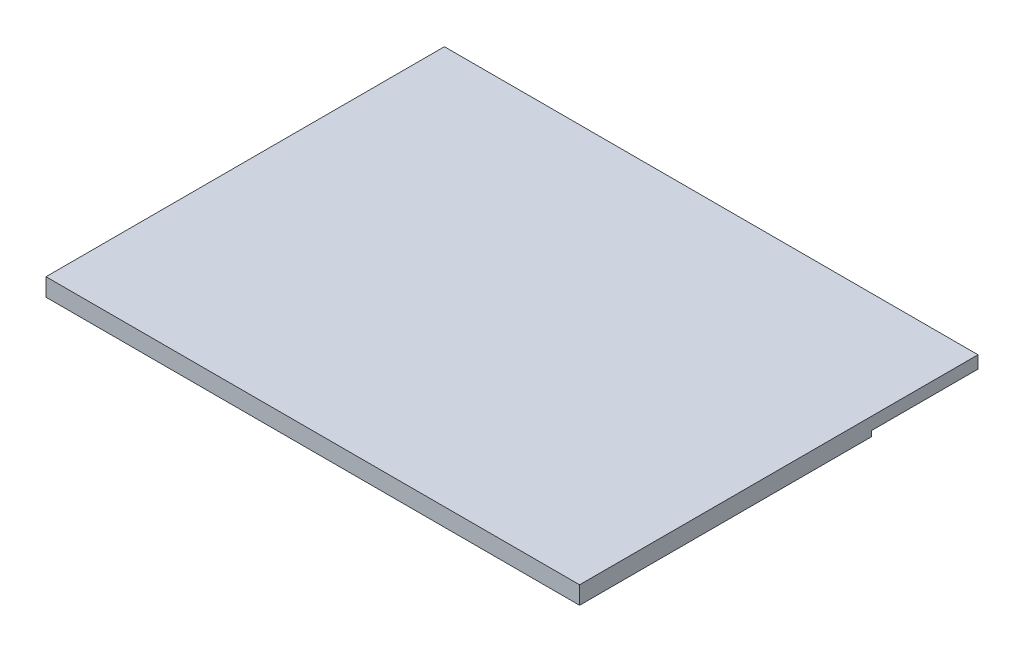
ISO-10303-21;
HEADER;
FILE_DESCRIPTION(('STEP AP214'),'2;1');
FILE_NAME('part.step','',(''),(''),'','','');
FILE_SCHEMA(('AUTOMOTIVE_DESIGN { 1 0 10303 214 1 1 1 1 }'));
ENDSEC;
DATA;
#1=APPLICATION_CONTEXT('core data for automotive mechanical design processes');
#2=APPLICATION_PROTOCOL_DEFINITION('international standard','automotive_design',2000,#1);
#3=PRODUCT_CONTEXT('',#1,'mechanical');
#4=PRODUCT('Part','Part','',(#3));
#5=PRODUCT_RELATED_PRODUCT_CATEGORY('part','',(#4));
#6=PRODUCT_DEFINITION_FORMATION('','',#4);
#7=PRODUCT_DEFINITION_CONTEXT('part definition',#1,'design');
#8=PRODUCT_DEFINITION('design','',#6,#7);
#9=PRODUCT_DEFINITION_SHAPE('','',#8);
#10=(LENGTH_UNIT() NAMED_UNIT(*) SI_UNIT(.MILLI.,.METRE.));
#11=(NAMED_UNIT(*) PLANE_ANGLE_UNIT() SI_UNIT($,.RADIAN.));
#12=(NAMED_UNIT(*) SI_UNIT($,.STERADIAN.) SOLID_ANGLE_UNIT());
#13=UNCERTAINTY_MEASURE_WITH_UNIT(LENGTH_MEASURE(1.E-05),#10,'distance_accuracy_value','');
#14=(GEOMETRIC_REPRESENTATION_CONTEXT(3) GLOBAL_UNCERTAINTY_ASSIGNED_CONTEXT((#13)) GLOBAL_UNIT_ASSIGNED_CONTEXT((#10,
#11,#12)) REPRESENTATION_CONTEXT('',''));
#15=CARTESIAN_POINT('',(0.,0.,0.));
#16=DIRECTION('',(0.,0.,1.));
#17=DIRECTION('',(1.,0.,0.));
#18=AXIS2_PLACEMENT_3D('',#15,#16,#17);
#19=CARTESIAN_POINT('',(141.251471862576,-4.6,188.57986601637));
#20=DIRECTION('',(0.,-1.,0.));
#21=DIRECTION('',(0.,0.,-1.));
#22=AXIS2_PLACEMENT_3D('',#19,#20,#21);
#23=PLANE('',#22);
#24=DIRECTION('',(1.,0.,0.));
#25=VECTOR('',#24,1.);
#26=CARTESIAN_POINT('',(141.251471862576,-4.6,51.));
#27=LINE('',#26,#25);
#28=CARTESIAN_POINT('',(5.74852813742385,-4.6,51.));
#29=VERTEX_POINT('',#28);
#30=CARTESIAN_POINT('',(139.251471862576,-4.6,51.));
#31=VERTEX_POINT('',#30);
#32=EDGE_CURVE('E219',#29,#31,#27,.T.);
#33=ORIENTED_EDGE('',*,*,#32,.F.);
#34=DIRECTION('',(0.,0.,-1.));
#35=VECTOR('',#34,1.);
#36=CARTESIAN_POINT('',(5.74852813742385,-4.6,188.57986601637));
#37=LINE('',#36,#35);
#38=CARTESIAN_POINT('',(5.74852813742385,-4.6,-56.));
#39=VERTEX_POINT('',#38);
#40=EDGE_CURVE('E277',#29,#39,#37,.T.);
#41=ORIENTED_EDGE('',*,*,#40,.T.);
#42=DIRECTION('',(-1.,0.,0.));
#43=VECTOR('',#42,1.);
#44=CARTESIAN_POINT('',(141.251471862576,-4.6,-56.));
#45=LINE('',#44,#43);
#46=CARTESIAN_POINT('',(139.251471862576,-4.6,-56.));
#47=VERTEX_POINT('',#46);
#48=EDGE_CURVE('E228',#47,#39,#45,.T.);
#49=ORIENTED_EDGE('',*,*,#48,.F.);
#50=DIRECTION('',(0.,0.,1.));
#51=VECTOR('',#50,1.);
#52=CARTESIAN_POINT('',(139.251471862576,-4.6,188.57986601637));
#53=LINE('',#52,#51);
#54=EDGE_CURVE('E275',#47,#31,#53,.T.);
#55=ORIENTED_EDGE('',*,*,#54,.T.);
#56=EDGE_LOOP('',(#33,#41,#49,#55));
#57=FACE_BOUND('',#56,.T.);
#58=DIRECTION('',(1.,0.,0.));
#59=VECTOR('',#58,1.);
#60=CARTESIAN_POINT('',(6.8485281374239,-4.6,-50.8));
#61=LINE('',#60,#59);
#62=CARTESIAN_POINT('',(6.8485281374239,-4.6,-50.8));
#63=VERTEX_POINT('',#62);
#64=CARTESIAN_POINT('',(138.151471862576,-4.6,-50.8));
#65=VERTEX_POINT('',#64);
#66=EDGE_CURVE('E181',#63,#65,#61,.T.);
#67=ORIENTED_EDGE('',*,*,#66,.F.);
#68=DIRECTION('',(0.,0.,-1.));
#69=VECTOR('',#68,1.);
#70=CARTESIAN_POINT('',(6.8485281374239,-4.6,-50.8));
#71=LINE('',#70,#69);
#72=CARTESIAN_POINT('',(6.8485281374239,-4.6,-35.8));
#73=VERTEX_POINT('',#72);
#74=EDGE_CURVE('E175',#73,#63,#71,.T.);
#75=ORIENTED_EDGE('',*,*,#74,.F.);
#76=DIRECTION('',(-1.,0.,0.));
#77=VECTOR('',#76,1.);
#78=CARTESIAN_POINT('',(6.8485281374239,-4.6,-35.8));
#79=LINE('',#78,#77);
#80=CARTESIAN_POINT('',(138.151471862576,-4.6,-35.8));
#81=VERTEX_POINT('',#80);
#82=EDGE_CURVE('E160',#81,#73,#79,.T.);
#83=ORIENTED_EDGE('',*,*,#82,.F.);
#84=DIRECTION('',(0.,0.,1.));
#85=VECTOR('',#84,1.);
#86=CARTESIAN_POINT('',(138.151471862576,-4.6,-50.8));
#87=LINE('',#86,#85);
#88=EDGE_CURVE('E169',#65,#81,#87,.T.);
#89=ORIENTED_EDGE('',*,*,#88,.F.);
#90=EDGE_LOOP('',(#67,#75,#83,#89));
#91=FACE_BOUND('',#90,.T.);
#92=ADVANCED_FACE('F41',(#57,#91),#23,.T.);
#93=CARTESIAN_POINT('',(-2.49999999999999,5.,-56.));
#94=DIRECTION('',(0.,0.,1.));
#95=DIRECTION('',(1.,0.,0.));
#96=AXIS2_PLACEMENT_3D('',#93,#94,#95);
#97=PLANE('',#96);
#98=DIRECTION('',(0.,-1.,0.));
#99=VECTOR('',#98,1.);
#100=CARTESIAN_POINT('',(147.5,5.,-56.));
#101=LINE('',#100,#99);
#102=CARTESIAN_POINT('',(147.5,5.,-56.));
#103=VERTEX_POINT('',#102);
#104=CARTESIAN_POINT('',(147.5,1.5,-56.));
#105=VERTEX_POINT('',#104);
#106=EDGE_CURVE('E249',#103,#105,#101,.T.);
#107=ORIENTED_EDGE('',*,*,#106,.T.);
#108=DIRECTION('',(1.,0.,0.));
#109=VECTOR('',#108,1.);
#110=CARTESIAN_POINT('',(147.5,1.5,-56.));
#111=LINE('',#110,#109);
#112=CARTESIAN_POINT('',(-2.5,1.50000000000009,-56.));
#113=VERTEX_POINT('',#112);
#114=EDGE_CURVE('E194',#113,#105,#111,.T.);
#115=ORIENTED_EDGE('',*,*,#114,.F.);
#116=DIRECTION('',(0.,-1.,0.));
#117=VECTOR('',#116,1.);
#118=CARTESIAN_POINT('',(-2.49999999999999,5.,-56.));
#119=LINE('',#118,#117);
#120=CARTESIAN_POINT('',(-2.49999999999999,5.,-56.));
#121=VERTEX_POINT('',#120);
#122=EDGE_CURVE('E267',#121,#113,#119,.T.);
#123=ORIENTED_EDGE('',*,*,#122,.F.);
#124=DIRECTION('',(-1.,0.,0.));
#125=VECTOR('',#124,1.);
#126=CARTESIAN_POINT('',(-2.49999999999999,5.,-56.));
#127=LINE('',#126,#125);
#128=EDGE_CURVE('E254',#103,#121,#127,.T.);
#129=ORIENTED_EDGE('',*,*,#128,.F.);
#130=EDGE_LOOP('',(#107,#115,#123,#129));
#131=FACE_BOUND('',#130,.T.);
#132=ADVANCED_FACE('F330',(#131),#97,.F.);
#133=CARTESIAN_POINT('',(0.,0.,0.));
#134=DIRECTION('',(0.,1.,0.));
#135=DIRECTION('',(0.,0.,1.));
#136=AXIS2_PLACEMENT_3D('',#133,#134,#135);
#137=PLANE('',#136);
#138=DIRECTION('',(-1.,0.,0.));
#139=VECTOR('',#138,1.);
#140=CARTESIAN_POINT('',(0.,0.,-26.));
#141=LINE('',#140,#139);
#142=CARTESIAN_POINT('',(147.5,0.,-26.));
#143=VERTEX_POINT('',#142);
#144=CARTESIAN_POINT('',(136.651471862576,0.,-26.));
#145=VERTEX_POINT('',#144);
#146=EDGE_CURVE('E209',#143,#145,#141,.T.);
#147=ORIENTED_EDGE('',*,*,#146,.F.);
#148=DIRECTION('',(0.,0.,1.));
#149=VECTOR('',#148,1.);
#150=CARTESIAN_POINT('',(147.5,0.,-56.));
#151=LINE('',#150,#149);
#152=CARTESIAN_POINT('',(147.5,0.,56.));
#153=VERTEX_POINT('',#152);
#154=EDGE_CURVE('E240',#143,#153,#151,.T.);
#155=ORIENTED_EDGE('',*,*,#154,.T.);
#156=DIRECTION('',(1.,0.,0.));
#157=VECTOR('',#156,1.);
#158=CARTESIAN_POINT('',(-2.49999999999997,0.,56.));
#159=LINE('',#158,#157);
#160=CARTESIAN_POINT('',(-2.49999999999997,0.,56.));
#161=VERTEX_POINT('',#160);
#162=EDGE_CURVE('E257',#161,#153,#159,.T.);
#163=ORIENTED_EDGE('',*,*,#162,.F.);
#164=DIRECTION('',(0.,0.,1.));
#165=VECTOR('',#164,1.);
#166=CARTESIAN_POINT('',(-2.49999999999999,0.,-56.));
#167=LINE('',#166,#165);
#168=CARTESIAN_POINT('',(-2.5,0.,-26.));
#169=VERTEX_POINT('',#168);
#170=EDGE_CURVE('E252',#169,#161,#167,.T.);
#171=ORIENTED_EDGE('',*,*,#170,.F.);
#172=CARTESIAN_POINT('',(8.3485281374239,0.,-26.));
#173=VERTEX_POINT('',#172);
#174=EDGE_CURVE('E213',#173,#169,#141,.T.);
#175=ORIENTED_EDGE('',*,*,#174,.F.);
#176=DIRECTION('',(0.,0.,-1.));
#177=VECTOR('',#176,1.);
#178=CARTESIAN_POINT('',(8.3485281374239,0.,188.57986601637));
#179=LINE('',#178,#177);
#180=CARTESIAN_POINT('',(8.34852813742391,0.,51.));
#181=VERTEX_POINT('',#180);
#182=EDGE_CURVE('E222',#181,#173,#179,.T.);
#183=ORIENTED_EDGE('',*,*,#182,.F.);
#184=DIRECTION('',(-1.,0.,0.));
#185=VECTOR('',#184,1.);
#186=CARTESIAN_POINT('',(136.651471862576,0.,51.));
#187=LINE('',#186,#185);
#188=CARTESIAN_POINT('',(136.651471862576,0.,51.));
#189=VERTEX_POINT('',#188);
#190=EDGE_CURVE('E225',#189,#181,#187,.T.);
#191=ORIENTED_EDGE('',*,*,#190,.F.);
#192=DIRECTION('',(0.,0.,-1.));
#193=VECTOR('',#192,1.);
#194=CARTESIAN_POINT('',(136.651471862576,0.,188.57986601637));
#195=LINE('',#194,#193);
#196=EDGE_CURVE('E233',#189,#145,#195,.T.);
#197=ORIENTED_EDGE('',*,*,#196,.T.);
#198=EDGE_LOOP('',(#147,#155,#163,#171,#175,#183,#191,#197));
#199=FACE_BOUND('',#198,.T.);
#200=ADVANCED_FACE('F318',(#199),#137,.F.);
#201=ORIENTED_EDGE('',*,*,#48,.T.);
#202=DIRECTION('',(0.707106781186532,-0.707106781186563,0.));
#203=VECTOR('',#202,1.);
#204=CARTESIAN_POINT('',(5.74852813742385,-4.6,-56.));
#205=LINE('',#204,#203);
#206=CARTESIAN_POINT('',(4.7485281374239,-3.6,-56.));
#207=VERTEX_POINT('',#206);
#208=EDGE_CURVE('E282',#39,#207,#205,.F.);
#209=ORIENTED_EDGE('',*,*,#208,.T.);
#210=DIRECTION('',(0.707106781186547,0.707106781186548,0.));
#211=VECTOR('',#210,1.);
#212=CARTESIAN_POINT('',(3.7485281374239,-4.6,-56.));
#213=LINE('',#212,#211);
#214=CARTESIAN_POINT('',(6.8485281374239,-1.5,-56.));
#215=VERTEX_POINT('',#214);
#216=EDGE_CURVE('E231',#207,#215,#213,.T.);
#217=ORIENTED_EDGE('',*,*,#216,.T.);
#218=DIRECTION('',(-1.,0.,0.));
#219=VECTOR('',#218,1.);
#220=CARTESIAN_POINT('',(147.5,-1.5,-56.));
#221=LINE('',#220,#219);
#222=CARTESIAN_POINT('',(138.151471862576,-1.5,-56.));
#223=VERTEX_POINT('',#222);
#224=EDGE_CURVE('E190',#223,#215,#221,.T.);
#225=ORIENTED_EDGE('',*,*,#224,.F.);
#226=DIRECTION('',(0.707106781186547,-0.707106781186548,0.));
#227=VECTOR('',#226,1.);
#228=CARTESIAN_POINT('',(136.651471862576,0.,-56.));
#229=LINE('',#228,#227);
#230=CARTESIAN_POINT('',(140.251471862576,-3.6,-56.));
#231=VERTEX_POINT('',#230);
#232=EDGE_CURVE('E218',#223,#231,#229,.T.);
#233=ORIENTED_EDGE('',*,*,#232,.T.);
#234=DIRECTION('',(0.707106781186548,0.707106781186547,0.));
#235=VECTOR('',#234,1.);
#236=CARTESIAN_POINT('',(140.251471862576,-3.6,-56.));
#237=LINE('',#236,#235);
#238=EDGE_CURVE('E280',#231,#47,#237,.F.);
#239=ORIENTED_EDGE('',*,*,#238,.T.);
#240=EDGE_LOOP('',(#201,#209,#217,#225,#233,#239));
#241=FACE_BOUND('',#240,.T.);
#242=ADVANCED_FACE('F299',(#241),#97,.F.);
#243=CARTESIAN_POINT('',(-2.49999999999999,5.,-56.));
#244=DIRECTION('',(1.,0.,0.));
#245=DIRECTION('',(0.,0.,-1.));
#246=AXIS2_PLACEMENT_3D('',#243,#244,#245);
#247=PLANE('',#246);
#248=ORIENTED_EDGE('',*,*,#122,.T.);
#249=DIRECTION('',(0.,0.,-1.));
#250=VECTOR('',#249,1.);
#251=CARTESIAN_POINT('',(-2.5,1.50000000000009,-26.));
#252=LINE('',#251,#250);
#253=CARTESIAN_POINT('',(-2.5,1.50000000000009,-26.));
#254=VERTEX_POINT('',#253);
#255=EDGE_CURVE('E202',#254,#113,#252,.T.);
#256=ORIENTED_EDGE('',*,*,#255,.F.);
#257=DIRECTION('',(0.,1.,0.));
#258=VECTOR('',#257,1.);
#259=CARTESIAN_POINT('',(-2.5,1.50000000000009,-26.));
#260=LINE('',#259,#258);
#261=EDGE_CURVE('E197',#169,#254,#260,.T.);
#262=ORIENTED_EDGE('',*,*,#261,.F.);
#263=ORIENTED_EDGE('',*,*,#170,.T.);
#264=DIRECTION('',(0.,-1.,0.));
#265=VECTOR('',#264,1.);
#266=CARTESIAN_POINT('',(-2.49999999999997,5.,56.));
#267=LINE('',#266,#265);
#268=CARTESIAN_POINT('',(-2.49999999999997,5.,56.));
#269=VERTEX_POINT('',#268);
#270=EDGE_CURVE('E261',#269,#161,#267,.T.);
#271=ORIENTED_EDGE('',*,*,#270,.F.);
#272=DIRECTION('',(0.,0.,1.));
#273=VECTOR('',#272,1.);
#274=CARTESIAN_POINT('',(-2.49999999999999,5.,-56.));
#275=LINE('',#274,#273);
#276=EDGE_CURVE('E256',#121,#269,#275,.T.);
#277=ORIENTED_EDGE('',*,*,#276,.F.);
#278=EDGE_LOOP('',(#248,#256,#262,#263,#271,#277));
#279=FACE_BOUND('',#278,.T.);
#280=ADVANCED_FACE('F356',(#279),#247,.F.);
#281=CARTESIAN_POINT('',(-2.49999999999997,5.,56.));
#282=DIRECTION('',(0.,0.,-1.));
#283=DIRECTION('',(-1.,0.,0.));
#284=AXIS2_PLACEMENT_3D('',#281,#282,#283);
#285=PLANE('',#284);
#286=ORIENTED_EDGE('',*,*,#162,.T.);
#287=DIRECTION('',(0.,1.,0.));
#288=VECTOR('',#287,1.);
#289=CARTESIAN_POINT('',(147.5,4.99999999999999,56.));
#290=LINE('',#289,#288);
#291=CARTESIAN_POINT('',(147.5,4.99999999999999,56.));
#292=VERTEX_POINT('',#291);
#293=EDGE_CURVE('E243',#153,#292,#290,.T.);
#294=ORIENTED_EDGE('',*,*,#293,.T.);
#295=DIRECTION('',(1.,0.,0.));
#296=VECTOR('',#295,1.);
#297=CARTESIAN_POINT('',(-2.49999999999997,5.,56.));
#298=LINE('',#297,#296);
#299=EDGE_CURVE('E259',#269,#292,#298,.T.);
#300=ORIENTED_EDGE('',*,*,#299,.F.);
#301=ORIENTED_EDGE('',*,*,#270,.T.);
#302=EDGE_LOOP('',(#286,#294,#300,#301));
#303=FACE_BOUND('',#302,.T.);
#304=ADVANCED_FACE('F350',(#303),#285,.F.);
#305=CARTESIAN_POINT('',(0.,5.,0.));
#306=DIRECTION('',(0.,1.,0.));
#307=DIRECTION('',(0.,0.,1.));
#308=AXIS2_PLACEMENT_3D('',#305,#306,#307);
#309=PLANE('',#308);
#310=ORIENTED_EDGE('',*,*,#299,.T.);
#311=DIRECTION('',(0.,0.,-1.));
#312=VECTOR('',#311,1.);
#313=CARTESIAN_POINT('',(147.5,5.,-56.));
#314=LINE('',#313,#312);
#315=EDGE_CURVE('E246',#292,#103,#314,.T.);
#316=ORIENTED_EDGE('',*,*,#315,.T.);
#317=ORIENTED_EDGE('',*,*,#128,.T.);
#318=ORIENTED_EDGE('',*,*,#276,.T.);
#319=EDGE_LOOP('',(#310,#316,#317,#318));
#320=FACE_BOUND('',#319,.T.);
#321=ADVANCED_FACE('F346',(#320),#309,.T.);
#322=CARTESIAN_POINT('',(147.5,-40.,-56.));
#323=DIRECTION('',(-1.,0.,0.));
#324=DIRECTION('',(0.,0.,1.));
#325=AXIS2_PLACEMENT_3D('',#322,#323,#324);
#326=PLANE('',#325);
#327=DIRECTION('',(0.,-1.,0.));
#328=VECTOR('',#327,1.);
#329=CARTESIAN_POINT('',(147.5,1.5,-26.));
#330=LINE('',#329,#328);
#331=CARTESIAN_POINT('',(147.5,1.5,-26.));
#332=VERTEX_POINT('',#331);
#333=EDGE_CURVE('E191',#332,#143,#330,.T.);
#334=ORIENTED_EDGE('',*,*,#333,.F.);
#335=DIRECTION('',(0.,0.,-1.));
#336=VECTOR('',#335,1.);
#337=CARTESIAN_POINT('',(147.5,1.5,-26.));
#338=LINE('',#337,#336);
#339=EDGE_CURVE('E206',#332,#105,#338,.T.);
#340=ORIENTED_EDGE('',*,*,#339,.T.);
#341=ORIENTED_EDGE('',*,*,#106,.F.);
#342=ORIENTED_EDGE('',*,*,#315,.F.);
#343=ORIENTED_EDGE('',*,*,#293,.F.);
#344=ORIENTED_EDGE('',*,*,#154,.F.);
#345=EDGE_LOOP('',(#334,#340,#341,#342,#343,#344));
#346=FACE_BOUND('',#345,.T.);
#347=ADVANCED_FACE('F343',(#346),#326,.F.);
#348=CARTESIAN_POINT('',(3.7485281374239,-4.6,188.57986601637));
#349=DIRECTION('',(-0.707106781186548,0.707106781186547,0.));
#350=DIRECTION('',(-0.707106781186547,-0.707106781186548,0.));
#351=AXIS2_PLACEMENT_3D('',#348,#349,#350);
#352=PLANE('',#351);
#353=ORIENTED_EDGE('',*,*,#216,.F.);
#354=DIRECTION('',(0.,0.,1.));
#355=VECTOR('',#354,1.);
#356=CARTESIAN_POINT('',(4.7485281374239,-3.6,188.57986601637));
#357=LINE('',#356,#355);
#358=CARTESIAN_POINT('',(4.7485281374239,-3.6,51.));
#359=VERTEX_POINT('',#358);
#360=EDGE_CURVE('E284',#207,#359,#357,.T.);
#361=ORIENTED_EDGE('',*,*,#360,.T.);
#362=DIRECTION('',(-0.707106781186547,-0.707106781186548,0.));
#363=VECTOR('',#362,1.);
#364=CARTESIAN_POINT('',(3.74852813742388,-4.60000000000002,51.));
#365=LINE('',#364,#363);
#366=EDGE_CURVE('E221',#181,#359,#365,.T.);
#367=ORIENTED_EDGE('',*,*,#366,.F.);
#368=ORIENTED_EDGE('',*,*,#182,.T.);
#369=DIRECTION('',(-0.707106781186547,-0.707106781186548,0.));
#370=VECTOR('',#369,1.);
#371=CARTESIAN_POINT('',(3.7485281374239,-4.6,-26.));
#372=LINE('',#371,#370);
#373=CARTESIAN_POINT('',(6.8485281374239,-1.5,-26.));
#374=VERTEX_POINT('',#373);
#375=EDGE_CURVE('E212',#173,#374,#372,.T.);
#376=ORIENTED_EDGE('',*,*,#375,.T.);
#377=DIRECTION('',(0.,0.,1.));
#378=VECTOR('',#377,1.);
#379=CARTESIAN_POINT('',(6.8485281374239,-1.5,188.57986601637));
#380=LINE('',#379,#378);
#381=EDGE_CURVE('E216',#215,#374,#380,.T.);
#382=ORIENTED_EDGE('',*,*,#381,.F.);
#383=EDGE_LOOP('',(#353,#361,#367,#368,#376,#382));
#384=FACE_BOUND('',#383,.T.);
#385=ADVANCED_FACE('F303',(#384),#352,.T.);
#386=CARTESIAN_POINT('',(136.651471862576,0.,188.57986601637));
#387=DIRECTION('',(0.707106781186548,0.707106781186547,0.));
#388=DIRECTION('',(-0.707106781186547,0.707106781186548,0.));
#389=AXIS2_PLACEMENT_3D('',#386,#387,#388);
#390=PLANE('',#389);
#391=DIRECTION('',(-0.707106781186547,0.707106781186548,0.));
#392=VECTOR('',#391,1.);
#393=CARTESIAN_POINT('',(136.651471862576,0.,51.));
#394=LINE('',#393,#392);
#395=CARTESIAN_POINT('',(140.251471862576,-3.6,51.));
#396=VERTEX_POINT('',#395);
#397=EDGE_CURVE('E238',#396,#189,#394,.T.);
#398=ORIENTED_EDGE('',*,*,#397,.F.);
#399=DIRECTION('',(0.,0.,-1.));
#400=VECTOR('',#399,1.);
#401=CARTESIAN_POINT('',(140.251471862576,-3.6,188.57986601637));
#402=LINE('',#401,#400);
#403=EDGE_CURVE('E11',#396,#231,#402,.T.);
#404=ORIENTED_EDGE('',*,*,#403,.T.);
#405=ORIENTED_EDGE('',*,*,#232,.F.);
#406=DIRECTION('',(0.,0.,-1.));
#407=VECTOR('',#406,1.);
#408=CARTESIAN_POINT('',(138.151471862576,-1.5,188.57986601637));
#409=LINE('',#408,#407);
#410=CARTESIAN_POINT('',(138.151471862576,-1.5,-26.));
#411=VERTEX_POINT('',#410);
#412=EDGE_CURVE('E273',#411,#223,#409,.T.);
#413=ORIENTED_EDGE('',*,*,#412,.F.);
#414=DIRECTION('',(-0.707106781186547,0.707106781186548,0.));
#415=VECTOR('',#414,1.);
#416=CARTESIAN_POINT('',(136.651471862576,0.,-26.));
#417=LINE('',#416,#415);
#418=EDGE_CURVE('E270',#411,#145,#417,.T.);
#419=ORIENTED_EDGE('',*,*,#418,.T.);
#420=ORIENTED_EDGE('',*,*,#196,.F.);
#421=EDGE_LOOP('',(#398,#404,#405,#413,#419,#420));
#422=FACE_BOUND('',#421,.T.);
#423=ADVANCED_FACE('F314',(#422),#390,.T.);
#424=CARTESIAN_POINT('',(2.50000000000006,0.,51.));
#425=DIRECTION('',(0.,0.,-1.));
#426=DIRECTION('',(-1.,0.,0.));
#427=AXIS2_PLACEMENT_3D('',#424,#425,#426);
#428=PLANE('',#427);
#429=ORIENTED_EDGE('',*,*,#366,.T.);
#430=DIRECTION('',(-0.707106781186532,0.707106781186563,0.));
#431=VECTOR('',#430,1.);
#432=CARTESIAN_POINT('',(5.74852813742386,-4.60000000000001,51.));
#433=LINE('',#432,#431);
#434=EDGE_CURVE('E50',#359,#29,#433,.F.);
#435=ORIENTED_EDGE('',*,*,#434,.T.);
#436=ORIENTED_EDGE('',*,*,#32,.T.);
#437=DIRECTION('',(-0.707106781186548,-0.707106781186547,0.));
#438=VECTOR('',#437,1.);
#439=CARTESIAN_POINT('',(140.251471862576,-3.60000000000002,51.));
#440=LINE('',#439,#438);
#441=EDGE_CURVE('E65',#31,#396,#440,.F.);
#442=ORIENTED_EDGE('',*,*,#441,.T.);
#443=ORIENTED_EDGE('',*,*,#397,.T.);
#444=ORIENTED_EDGE('',*,*,#190,.T.);
#445=EDGE_LOOP('',(#429,#435,#436,#442,#443,#444));
#446=FACE_BOUND('',#445,.T.);
#447=ADVANCED_FACE('F288',(#446),#428,.F.);
#448=CARTESIAN_POINT('',(0.,0.,-26.));
#449=DIRECTION('',(0.,0.,-1.));
#450=DIRECTION('',(-1.,0.,0.));
#451=AXIS2_PLACEMENT_3D('',#448,#449,#450);
#452=PLANE('',#451);
#453=ORIENTED_EDGE('',*,*,#174,.T.);
#454=ORIENTED_EDGE('',*,*,#261,.T.);
#455=DIRECTION('',(1.,0.,0.));
#456=VECTOR('',#455,1.);
#457=CARTESIAN_POINT('',(147.5,1.5,-26.));
#458=LINE('',#457,#456);
#459=EDGE_CURVE('E199',#254,#332,#458,.T.);
#460=ORIENTED_EDGE('',*,*,#459,.T.);
#461=ORIENTED_EDGE('',*,*,#333,.T.);
#462=ORIENTED_EDGE('',*,*,#146,.T.);
#463=ORIENTED_EDGE('',*,*,#418,.F.);
#464=DIRECTION('',(-1.,0.,0.));
#465=VECTOR('',#464,1.);
#466=CARTESIAN_POINT('',(147.5,-1.5,-26.));
#467=LINE('',#466,#465);
#468=EDGE_CURVE('E193',#411,#374,#467,.T.);
#469=ORIENTED_EDGE('',*,*,#468,.T.);
#470=ORIENTED_EDGE('',*,*,#375,.F.);
#471=EDGE_LOOP('',(#453,#454,#460,#461,#462,#463,#469,#470));
#472=FACE_BOUND('',#471,.T.);
#473=ADVANCED_FACE('F309',(#472),#452,.T.);
#474=CARTESIAN_POINT('',(147.5,1.5,-26.));
#475=DIRECTION('',(0.,1.,0.));
#476=DIRECTION('',(-1.,0.,0.));
#477=AXIS2_PLACEMENT_3D('',#474,#475,#476);
#478=PLANE('',#477);
#479=ORIENTED_EDGE('',*,*,#114,.T.);
#480=ORIENTED_EDGE('',*,*,#339,.F.);
#481=ORIENTED_EDGE('',*,*,#459,.F.);
#482=ORIENTED_EDGE('',*,*,#255,.T.);
#483=EDGE_LOOP('',(#479,#480,#481,#482));
#484=FACE_BOUND('',#483,.T.);
#485=ADVANCED_FACE('F400',(#484),#478,.F.);
#486=CARTESIAN_POINT('',(147.5,-1.5,-26.));
#487=DIRECTION('',(0.,-1.,0.));
#488=DIRECTION('',(0.,0.,-1.));
#489=AXIS2_PLACEMENT_3D('',#486,#487,#488);
#490=PLANE('',#489);
#491=ORIENTED_EDGE('',*,*,#381,.T.);
#492=ORIENTED_EDGE('',*,*,#468,.F.);
#493=ORIENTED_EDGE('',*,*,#412,.T.);
#494=ORIENTED_EDGE('',*,*,#224,.T.);
#495=EDGE_LOOP('',(#491,#492,#493,#494));
#496=FACE_BOUND('',#495,.T.);
#497=ADVANCED_FACE('F306',(#496),#490,.F.);
#498=CARTESIAN_POINT('',(5.74852813742385,-4.6,188.57986601637));
#499=DIRECTION('',(0.707106781186563,0.707106781186532,0.));
#500=DIRECTION('',(0.,0.,-1.));
#501=AXIS2_PLACEMENT_3D('',#498,#499,#500);
#502=PLANE('',#501);
#503=ORIENTED_EDGE('',*,*,#434,.F.);
#504=ORIENTED_EDGE('',*,*,#360,.F.);
#505=ORIENTED_EDGE('',*,*,#208,.F.);
#506=ORIENTED_EDGE('',*,*,#40,.F.);
#507=EDGE_LOOP('',(#503,#504,#505,#506));
#508=FACE_BOUND('',#507,.T.);
#509=ADVANCED_FACE('F296',(#508),#502,.F.);
#510=CARTESIAN_POINT('',(140.251471862576,-3.6,188.57986601637));
#511=DIRECTION('',(-0.707106781186547,0.707106781186548,0.));
#512=DIRECTION('',(0.,0.,-1.));
#513=AXIS2_PLACEMENT_3D('',#510,#511,#512);
#514=PLANE('',#513);
#515=ORIENTED_EDGE('',*,*,#441,.F.);
#516=ORIENTED_EDGE('',*,*,#54,.F.);
#517=ORIENTED_EDGE('',*,*,#238,.F.);
#518=ORIENTED_EDGE('',*,*,#403,.F.);
#519=EDGE_LOOP('',(#515,#516,#517,#518));
#520=FACE_BOUND('',#519,.T.);
#521=ADVANCED_FACE('F44',(#520),#514,.F.);
#522=CARTESIAN_POINT('',(6.8485281374239,-6.6,-50.8));
#523=DIRECTION('',(1.,0.,0.));
#524=DIRECTION('',(0.,0.,-1.));
#525=AXIS2_PLACEMENT_3D('',#522,#523,#524);
#526=PLANE('',#525);
#527=DIRECTION('',(0.,1.,0.));
#528=VECTOR('',#527,1.);
#529=CARTESIAN_POINT('',(6.8485281374239,-6.6,-50.8));
#530=LINE('',#529,#528);
#531=CARTESIAN_POINT('',(6.8485281374239,-6.36099337678656,-50.8));
#532=VERTEX_POINT('',#531);
#533=EDGE_CURVE('E177',#532,#63,#530,.T.);
#534=ORIENTED_EDGE('',*,*,#533,.F.);
#535=DIRECTION('',(0.,-0.116598787687927,-0.993179099009693));
#536=VECTOR('',#535,1.);
#537=CARTESIAN_POINT('',(6.8485281374239,-4.6,-35.8));
#538=LINE('',#537,#536);
#539=EDGE_CURVE('E163',#73,#532,#538,.T.);
#540=ORIENTED_EDGE('',*,*,#539,.F.);
#541=ORIENTED_EDGE('',*,*,#74,.T.);
#542=EDGE_LOOP('',(#534,#540,#541));
#543=FACE_BOUND('',#542,.T.);
#544=ADVANCED_FACE('F174',(#543),#526,.F.);
#545=CARTESIAN_POINT('',(6.8485281374239,-6.6,-50.8));
#546=DIRECTION('',(0.,0.,1.));
#547=DIRECTION('',(1.,0.,0.));
#548=AXIS2_PLACEMENT_3D('',#545,#546,#547);
#549=PLANE('',#548);
#550=DIRECTION('',(0.,1.,0.));
#551=VECTOR('',#550,1.);
#552=CARTESIAN_POINT('',(138.151471862576,-6.6,-50.8));
#553=LINE('',#552,#551);
#554=CARTESIAN_POINT('',(138.151471862576,-6.36099337678656,-50.8));
#555=VERTEX_POINT('',#554);
#556=EDGE_CURVE('E168',#555,#65,#553,.T.);
#557=ORIENTED_EDGE('',*,*,#556,.F.);
#558=DIRECTION('',(-1.,0.,0.));
#559=VECTOR('',#558,1.);
#560=CARTESIAN_POINT('',(6.8485281374239,-6.36099337678656,-50.8));
#561=LINE('',#560,#559);
#562=EDGE_CURVE('E178',#555,#532,#561,.T.);
#563=ORIENTED_EDGE('',*,*,#562,.T.);
#564=ORIENTED_EDGE('',*,*,#533,.T.);
#565=ORIENTED_EDGE('',*,*,#66,.T.);
#566=EDGE_LOOP('',(#557,#563,#564,#565));
#567=FACE_BOUND('',#566,.T.);
#568=ADVANCED_FACE('F327',(#567),#549,.F.);
#569=CARTESIAN_POINT('',(138.151471862576,-6.6,-50.8));
#570=DIRECTION('',(-1.,0.,0.));
#571=DIRECTION('',(0.,0.,1.));
#572=AXIS2_PLACEMENT_3D('',#569,#570,#571);
#573=PLANE('',#572);
#574=ORIENTED_EDGE('',*,*,#88,.T.);
#575=DIRECTION('',(0.,0.116598787687927,0.993179099009693));
#576=VECTOR('',#575,1.);
#577=CARTESIAN_POINT('',(138.151471862576,-4.6,-35.8));
#578=LINE('',#577,#576);
#579=EDGE_CURVE('E57',#555,#81,#578,.T.);
#580=ORIENTED_EDGE('',*,*,#579,.F.);
#581=ORIENTED_EDGE('',*,*,#556,.T.);
#582=EDGE_LOOP('',(#574,#580,#581));
#583=FACE_BOUND('',#582,.T.);
#584=ADVANCED_FACE('F442',(#583),#573,.F.);
#585=CARTESIAN_POINT('',(-10.3043088659327,-4.6,-35.8));
#586=DIRECTION('',(0.,0.993179099009693,-0.116598787687927));
#587=DIRECTION('',(0.,0.116598787687927,0.993179099009693));
#588=AXIS2_PLACEMENT_3D('',#585,#586,#587);
#589=PLANE('',#588);
#590=ORIENTED_EDGE('',*,*,#579,.T.);
#591=ORIENTED_EDGE('',*,*,#82,.T.);
#592=ORIENTED_EDGE('',*,*,#539,.T.);
#593=ORIENTED_EDGE('',*,*,#562,.F.);
#594=EDGE_LOOP('',(#590,#591,#592,#593));
#595=FACE_BOUND('',#594,.T.);
#596=ADVANCED_FACE('F162',(#595),#589,.F.);
#597=CLOSED_SHELL('',(#92,#132,#200,#242,#280,#304,#321,#347,#385,#423,#447,#473,#485,#497,#509,
#521,#544,#568,#584,#596));
#598=MANIFOLD_SOLID_BREP('B2',#597);
#599=ADVANCED_BREP_SHAPE_REPRESENTATION('',(#18,#598),#14);
#600=SHAPE_DEFINITION_REPRESENTATION(#9,#599);
ENDSEC;
END-ISO-10303-21;
